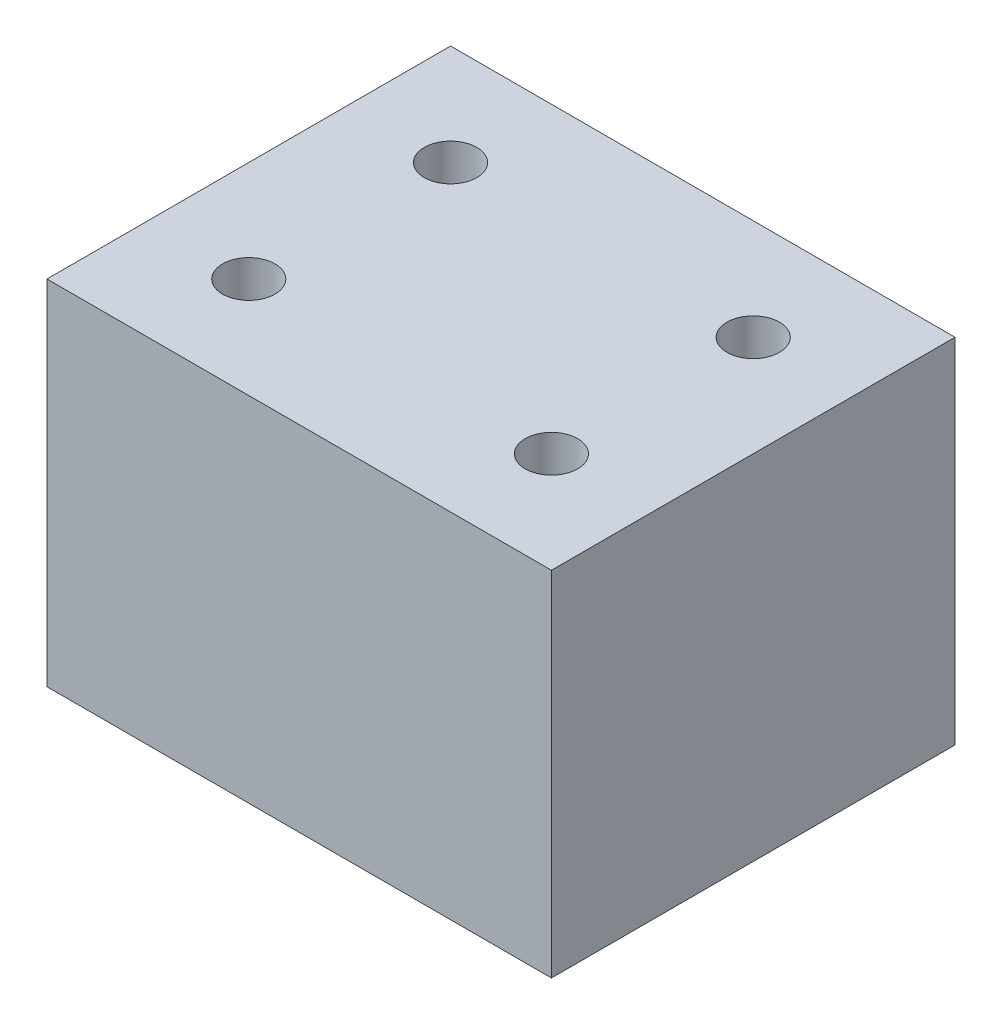
ISO-10303-21;
HEADER;
FILE_DESCRIPTION(('STEP AP214'),'2;1');
FILE_NAME('part.step','',(''),(''),'','','');
FILE_SCHEMA(('AUTOMOTIVE_DESIGN { 1 0 10303 214 1 1 1 1 }'));
ENDSEC;
DATA;
#1=APPLICATION_CONTEXT('core data for automotive mechanical design processes');
#2=APPLICATION_PROTOCOL_DEFINITION('international standard','automotive_design',2000,#1);
#3=PRODUCT_CONTEXT('',#1,'mechanical');
#4=PRODUCT('Part','Part','',(#3));
#5=PRODUCT_RELATED_PRODUCT_CATEGORY('part','',(#4));
#6=PRODUCT_DEFINITION_FORMATION('','',#4);
#7=PRODUCT_DEFINITION_CONTEXT('part definition',#1,'design');
#8=PRODUCT_DEFINITION('design','',#6,#7);
#9=PRODUCT_DEFINITION_SHAPE('','',#8);
#10=(LENGTH_UNIT() NAMED_UNIT(*) SI_UNIT(.MILLI.,.METRE.));
#11=(NAMED_UNIT(*) PLANE_ANGLE_UNIT() SI_UNIT($,.RADIAN.));
#12=(NAMED_UNIT(*) SI_UNIT($,.STERADIAN.) SOLID_ANGLE_UNIT());
#13=UNCERTAINTY_MEASURE_WITH_UNIT(LENGTH_MEASURE(1.E-05),#10,'distance_accuracy_value','');
#14=(GEOMETRIC_REPRESENTATION_CONTEXT(3) GLOBAL_UNCERTAINTY_ASSIGNED_CONTEXT((#13)) GLOBAL_UNIT_ASSIGNED_CONTEXT((#10,
#11,#12)) REPRESENTATION_CONTEXT('',''));
#15=CARTESIAN_POINT('',(0.,0.,0.));
#16=DIRECTION('',(0.,0.,1.));
#17=DIRECTION('',(1.,0.,0.));
#18=AXIS2_PLACEMENT_3D('',#15,#16,#17);
#19=CARTESIAN_POINT('',(25.,35.,-20.));
#20=DIRECTION('',(-1.,0.,0.));
#21=DIRECTION('',(0.,0.,1.));
#22=AXIS2_PLACEMENT_3D('',#19,#20,#21);
#23=PLANE('',#22);
#24=DIRECTION('',(0.,0.,-1.));
#25=VECTOR('',#24,1.);
#26=CARTESIAN_POINT('',(25.,0.,-20.));
#27=LINE('',#26,#25);
#28=CARTESIAN_POINT('',(25.,0.,20.));
#29=VERTEX_POINT('',#28);
#30=CARTESIAN_POINT('',(25.,0.,-20.));
#31=VERTEX_POINT('',#30);
#32=EDGE_CURVE('E96',#29,#31,#27,.T.);
#33=ORIENTED_EDGE('',*,*,#32,.T.);
#34=DIRECTION('',(0.,-1.,0.));
#35=VECTOR('',#34,1.);
#36=CARTESIAN_POINT('',(25.,35.,-20.));
#37=LINE('',#36,#35);
#38=CARTESIAN_POINT('',(25.,35.,-20.));
#39=VERTEX_POINT('',#38);
#40=EDGE_CURVE('E11',#39,#31,#37,.T.);
#41=ORIENTED_EDGE('',*,*,#40,.F.);
#42=DIRECTION('',(0.,0.,-1.));
#43=VECTOR('',#42,1.);
#44=CARTESIAN_POINT('',(25.,35.,-20.));
#45=LINE('',#44,#43);
#46=CARTESIAN_POINT('',(25.,35.,20.));
#47=VERTEX_POINT('',#46);
#48=EDGE_CURVE('E84',#47,#39,#45,.T.);
#49=ORIENTED_EDGE('',*,*,#48,.F.);
#50=DIRECTION('',(0.,-1.,0.));
#51=VECTOR('',#50,1.);
#52=CARTESIAN_POINT('',(25.,35.,20.));
#53=LINE('',#52,#51);
#54=EDGE_CURVE('E92',#47,#29,#53,.T.);
#55=ORIENTED_EDGE('',*,*,#54,.T.);
#56=EDGE_LOOP('',(#33,#41,#49,#55));
#57=FACE_BOUND('',#56,.T.);
#58=ADVANCED_FACE('F33',(#57),#23,.F.);
#59=CARTESIAN_POINT('',(-25.,35.,-20.));
#60=DIRECTION('',(0.,0.,1.));
#61=DIRECTION('',(1.,0.,0.));
#62=AXIS2_PLACEMENT_3D('',#59,#60,#61);
#63=PLANE('',#62);
#64=DIRECTION('',(-1.,0.,0.));
#65=VECTOR('',#64,1.);
#66=CARTESIAN_POINT('',(-25.,0.,-20.));
#67=LINE('',#66,#65);
#68=CARTESIAN_POINT('',(-25.,0.,-20.));
#69=VERTEX_POINT('',#68);
#70=EDGE_CURVE('E88',#31,#69,#67,.T.);
#71=ORIENTED_EDGE('',*,*,#70,.T.);
#72=DIRECTION('',(0.,-1.,0.));
#73=VECTOR('',#72,1.);
#74=CARTESIAN_POINT('',(-25.,35.,-20.));
#75=LINE('',#74,#73);
#76=CARTESIAN_POINT('',(-25.,35.,-20.));
#77=VERTEX_POINT('',#76);
#78=EDGE_CURVE('E41',#77,#69,#75,.T.);
#79=ORIENTED_EDGE('',*,*,#78,.F.);
#80=DIRECTION('',(-1.,0.,0.));
#81=VECTOR('',#80,1.);
#82=CARTESIAN_POINT('',(-25.,35.,-20.));
#83=LINE('',#82,#81);
#84=EDGE_CURVE('E79',#39,#77,#83,.T.);
#85=ORIENTED_EDGE('',*,*,#84,.F.);
#86=ORIENTED_EDGE('',*,*,#40,.T.);
#87=EDGE_LOOP('',(#71,#79,#85,#86));
#88=FACE_BOUND('',#87,.T.);
#89=ADVANCED_FACE('F87',(#88),#63,.F.);
#90=CARTESIAN_POINT('',(-25.,35.,-20.));
#91=DIRECTION('',(1.,0.,0.));
#92=DIRECTION('',(0.,0.,-1.));
#93=AXIS2_PLACEMENT_3D('',#90,#91,#92);
#94=PLANE('',#93);
#95=DIRECTION('',(0.,0.,1.));
#96=VECTOR('',#95,1.);
#97=CARTESIAN_POINT('',(-25.,0.,-20.));
#98=LINE('',#97,#96);
#99=CARTESIAN_POINT('',(-25.,0.,20.));
#100=VERTEX_POINT('',#99);
#101=EDGE_CURVE('E66',#69,#100,#98,.T.);
#102=ORIENTED_EDGE('',*,*,#101,.T.);
#103=DIRECTION('',(0.,-1.,0.));
#104=VECTOR('',#103,1.);
#105=CARTESIAN_POINT('',(-25.,35.,20.));
#106=LINE('',#105,#104);
#107=CARTESIAN_POINT('',(-25.,35.,20.));
#108=VERTEX_POINT('',#107);
#109=EDGE_CURVE('E89',#108,#100,#106,.T.);
#110=ORIENTED_EDGE('',*,*,#109,.F.);
#111=DIRECTION('',(0.,0.,1.));
#112=VECTOR('',#111,1.);
#113=CARTESIAN_POINT('',(-25.,35.,-20.));
#114=LINE('',#113,#112);
#115=EDGE_CURVE('E82',#77,#108,#114,.T.);
#116=ORIENTED_EDGE('',*,*,#115,.F.);
#117=ORIENTED_EDGE('',*,*,#78,.T.);
#118=EDGE_LOOP('',(#102,#110,#116,#117));
#119=FACE_BOUND('',#118,.T.);
#120=ADVANCED_FACE('F90',(#119),#94,.F.);
#121=CARTESIAN_POINT('',(-25.,35.,20.));
#122=DIRECTION('',(0.,0.,-1.));
#123=DIRECTION('',(-1.,0.,0.));
#124=AXIS2_PLACEMENT_3D('',#121,#122,#123);
#125=PLANE('',#124);
#126=DIRECTION('',(1.,0.,0.));
#127=VECTOR('',#126,1.);
#128=CARTESIAN_POINT('',(-25.,0.,20.));
#129=LINE('',#128,#127);
#130=EDGE_CURVE('E72',#100,#29,#129,.T.);
#131=ORIENTED_EDGE('',*,*,#130,.T.);
#132=ORIENTED_EDGE('',*,*,#54,.F.);
#133=DIRECTION('',(1.,0.,0.));
#134=VECTOR('',#133,1.);
#135=CARTESIAN_POINT('',(-25.,35.,20.));
#136=LINE('',#135,#134);
#137=EDGE_CURVE('E49',#108,#47,#136,.T.);
#138=ORIENTED_EDGE('',*,*,#137,.F.);
#139=ORIENTED_EDGE('',*,*,#109,.T.);
#140=EDGE_LOOP('',(#131,#132,#138,#139));
#141=FACE_BOUND('',#140,.T.);
#142=ADVANCED_FACE('F104',(#141),#125,.F.);
#143=CARTESIAN_POINT('',(0.,35.,0.));
#144=DIRECTION('',(0.,1.,0.));
#145=DIRECTION('',(0.,0.,1.));
#146=AXIS2_PLACEMENT_3D('',#143,#144,#145);
#147=PLANE('',#146);
#148=CARTESIAN_POINT('',(15.,35.,10.));
#149=DIRECTION('',(0.,1.,0.));
#150=DIRECTION('',(0.,0.,1.));
#151=AXIS2_PLACEMENT_3D('',#148,#149,#150);
#152=CIRCLE('',#151,2.6);
#153=CARTESIAN_POINT('',(15.,35.,12.6));
#154=VERTEX_POINT('',#153);
#155=EDGE_CURVE('E123',#154,#154,#152,.T.);
#156=ORIENTED_EDGE('',*,*,#155,.F.);
#157=EDGE_LOOP('',(#156));
#158=FACE_BOUND('',#157,.T.);
#159=CARTESIAN_POINT('',(-15.0000000000001,35.,-10.));
#160=DIRECTION('',(0.,1.,0.));
#161=DIRECTION('',(0.,0.,1.));
#162=AXIS2_PLACEMENT_3D('',#159,#160,#161);
#163=CIRCLE('',#162,2.6);
#164=CARTESIAN_POINT('',(-15.0000000000001,35.,-7.4));
#165=VERTEX_POINT('',#164);
#166=EDGE_CURVE('E116',#165,#165,#163,.T.);
#167=ORIENTED_EDGE('',*,*,#166,.F.);
#168=EDGE_LOOP('',(#167));
#169=FACE_BOUND('',#168,.T.);
#170=CARTESIAN_POINT('',(15.,35.,-10.));
#171=DIRECTION('',(0.,1.,0.));
#172=DIRECTION('',(0.,0.,1.));
#173=AXIS2_PLACEMENT_3D('',#170,#171,#172);
#174=CIRCLE('',#173,2.6);
#175=CARTESIAN_POINT('',(15.,35.,-7.4));
#176=VERTEX_POINT('',#175);
#177=EDGE_CURVE('E128',#176,#176,#174,.T.);
#178=ORIENTED_EDGE('',*,*,#177,.F.);
#179=EDGE_LOOP('',(#178));
#180=FACE_BOUND('',#179,.T.);
#181=CARTESIAN_POINT('',(-15.,35.,10.));
#182=DIRECTION('',(0.,1.,0.));
#183=DIRECTION('',(0.,0.,1.));
#184=AXIS2_PLACEMENT_3D('',#181,#182,#183);
#185=CIRCLE('',#184,2.6);
#186=CARTESIAN_POINT('',(-15.,35.,12.6));
#187=VERTEX_POINT('',#186);
#188=EDGE_CURVE('E110',#187,#187,#185,.T.);
#189=ORIENTED_EDGE('',*,*,#188,.F.);
#190=EDGE_LOOP('',(#189));
#191=FACE_BOUND('',#190,.T.);
#192=ORIENTED_EDGE('',*,*,#48,.T.);
#193=ORIENTED_EDGE('',*,*,#84,.T.);
#194=ORIENTED_EDGE('',*,*,#115,.T.);
#195=ORIENTED_EDGE('',*,*,#137,.T.);
#196=EDGE_LOOP('',(#192,#193,#194,#195));
#197=FACE_BOUND('',#196,.T.);
#198=ADVANCED_FACE('F80',(#158,#169,#180,#191,#197),#147,.T.);
#199=CARTESIAN_POINT('',(0.,0.,0.));
#200=DIRECTION('',(0.,1.,0.));
#201=DIRECTION('',(0.,0.,1.));
#202=AXIS2_PLACEMENT_3D('',#199,#200,#201);
#203=PLANE('',#202);
#204=CARTESIAN_POINT('',(15.,0.,10.));
#205=DIRECTION('',(0.,1.,0.));
#206=DIRECTION('',(0.,0.,1.));
#207=AXIS2_PLACEMENT_3D('',#204,#205,#206);
#208=CIRCLE('',#207,2.6);
#209=CARTESIAN_POINT('',(15.,0.,12.6));
#210=VERTEX_POINT('',#209);
#211=EDGE_CURVE('E113',#210,#210,#208,.T.);
#212=ORIENTED_EDGE('',*,*,#211,.T.);
#213=EDGE_LOOP('',(#212));
#214=FACE_BOUND('',#213,.T.);
#215=CARTESIAN_POINT('',(-15.0000000000001,0.,-10.));
#216=DIRECTION('',(0.,1.,0.));
#217=DIRECTION('',(0.,0.,1.));
#218=AXIS2_PLACEMENT_3D('',#215,#216,#217);
#219=CIRCLE('',#218,2.6);
#220=CARTESIAN_POINT('',(-15.0000000000001,0.,-7.4));
#221=VERTEX_POINT('',#220);
#222=EDGE_CURVE('E119',#221,#221,#219,.T.);
#223=ORIENTED_EDGE('',*,*,#222,.T.);
#224=EDGE_LOOP('',(#223));
#225=FACE_BOUND('',#224,.T.);
#226=CARTESIAN_POINT('',(15.,0.,-10.));
#227=DIRECTION('',(0.,1.,0.));
#228=DIRECTION('',(0.,0.,1.));
#229=AXIS2_PLACEMENT_3D('',#226,#227,#228);
#230=CIRCLE('',#229,2.6);
#231=CARTESIAN_POINT('',(15.,0.,-7.4));
#232=VERTEX_POINT('',#231);
#233=EDGE_CURVE('E120',#232,#232,#230,.T.);
#234=ORIENTED_EDGE('',*,*,#233,.T.);
#235=EDGE_LOOP('',(#234));
#236=FACE_BOUND('',#235,.T.);
#237=CARTESIAN_POINT('',(-15.,0.,10.));
#238=DIRECTION('',(0.,1.,0.));
#239=DIRECTION('',(0.,0.,1.));
#240=AXIS2_PLACEMENT_3D('',#237,#238,#239);
#241=CIRCLE('',#240,2.6);
#242=CARTESIAN_POINT('',(-15.,0.,12.6));
#243=VERTEX_POINT('',#242);
#244=EDGE_CURVE('E99',#243,#243,#241,.T.);
#245=ORIENTED_EDGE('',*,*,#244,.T.);
#246=EDGE_LOOP('',(#245));
#247=FACE_BOUND('',#246,.T.);
#248=ORIENTED_EDGE('',*,*,#32,.F.);
#249=ORIENTED_EDGE('',*,*,#130,.F.);
#250=ORIENTED_EDGE('',*,*,#101,.F.);
#251=ORIENTED_EDGE('',*,*,#70,.F.);
#252=EDGE_LOOP('',(#248,#249,#250,#251));
#253=FACE_BOUND('',#252,.T.);
#254=ADVANCED_FACE('F107',(#214,#225,#236,#247,#253),#203,.F.);
#255=CARTESIAN_POINT('',(-15.,0.,10.));
#256=DIRECTION('',(0.,1.,0.));
#257=DIRECTION('',(0.,0.,1.));
#258=AXIS2_PLACEMENT_3D('',#255,#256,#257);
#259=CYLINDRICAL_SURFACE('',#258,2.6);
#260=ORIENTED_EDGE('',*,*,#244,.F.);
#261=EDGE_LOOP('',(#260));
#262=FACE_BOUND('',#261,.T.);
#263=ORIENTED_EDGE('',*,*,#188,.T.);
#264=EDGE_LOOP('',(#263));
#265=FACE_BOUND('',#264,.T.);
#266=ADVANCED_FACE('F140',(#262,#265),#259,.F.);
#267=CARTESIAN_POINT('',(15.,0.,-10.));
#268=DIRECTION('',(0.,1.,0.));
#269=DIRECTION('',(0.,0.,1.));
#270=AXIS2_PLACEMENT_3D('',#267,#268,#269);
#271=CYLINDRICAL_SURFACE('',#270,2.6);
#272=ORIENTED_EDGE('',*,*,#233,.F.);
#273=EDGE_LOOP('',(#272));
#274=FACE_BOUND('',#273,.T.);
#275=ORIENTED_EDGE('',*,*,#177,.T.);
#276=EDGE_LOOP('',(#275));
#277=FACE_BOUND('',#276,.T.);
#278=ADVANCED_FACE('F136',(#274,#277),#271,.F.);
#279=CARTESIAN_POINT('',(-15.0000000000001,0.,-10.));
#280=DIRECTION('',(0.,1.,0.));
#281=DIRECTION('',(0.,0.,1.));
#282=AXIS2_PLACEMENT_3D('',#279,#280,#281);
#283=CYLINDRICAL_SURFACE('',#282,2.6);
#284=ORIENTED_EDGE('',*,*,#222,.F.);
#285=EDGE_LOOP('',(#284));
#286=FACE_BOUND('',#285,.T.);
#287=ORIENTED_EDGE('',*,*,#166,.T.);
#288=EDGE_LOOP('',(#287));
#289=FACE_BOUND('',#288,.T.);
#290=ADVANCED_FACE('F139',(#286,#289),#283,.F.);
#291=CARTESIAN_POINT('',(15.,0.,10.));
#292=DIRECTION('',(0.,1.,0.));
#293=DIRECTION('',(0.,0.,1.));
#294=AXIS2_PLACEMENT_3D('',#291,#292,#293);
#295=CYLINDRICAL_SURFACE('',#294,2.6);
#296=ORIENTED_EDGE('',*,*,#211,.F.);
#297=EDGE_LOOP('',(#296));
#298=FACE_BOUND('',#297,.T.);
#299=ORIENTED_EDGE('',*,*,#155,.T.);
#300=EDGE_LOOP('',(#299));
#301=FACE_BOUND('',#300,.T.);
#302=ADVANCED_FACE('F201',(#298,#301),#295,.F.);
#303=CLOSED_SHELL('',(#58,#89,#120,#142,#198,#254,#266,#278,#290,#302));
#304=MANIFOLD_SOLID_BREP('B2',#303);
#305=ADVANCED_BREP_SHAPE_REPRESENTATION('',(#18,#304),#14);
#306=SHAPE_DEFINITION_REPRESENTATION(#9,#305);
ENDSEC;
END-ISO-10303-21;
